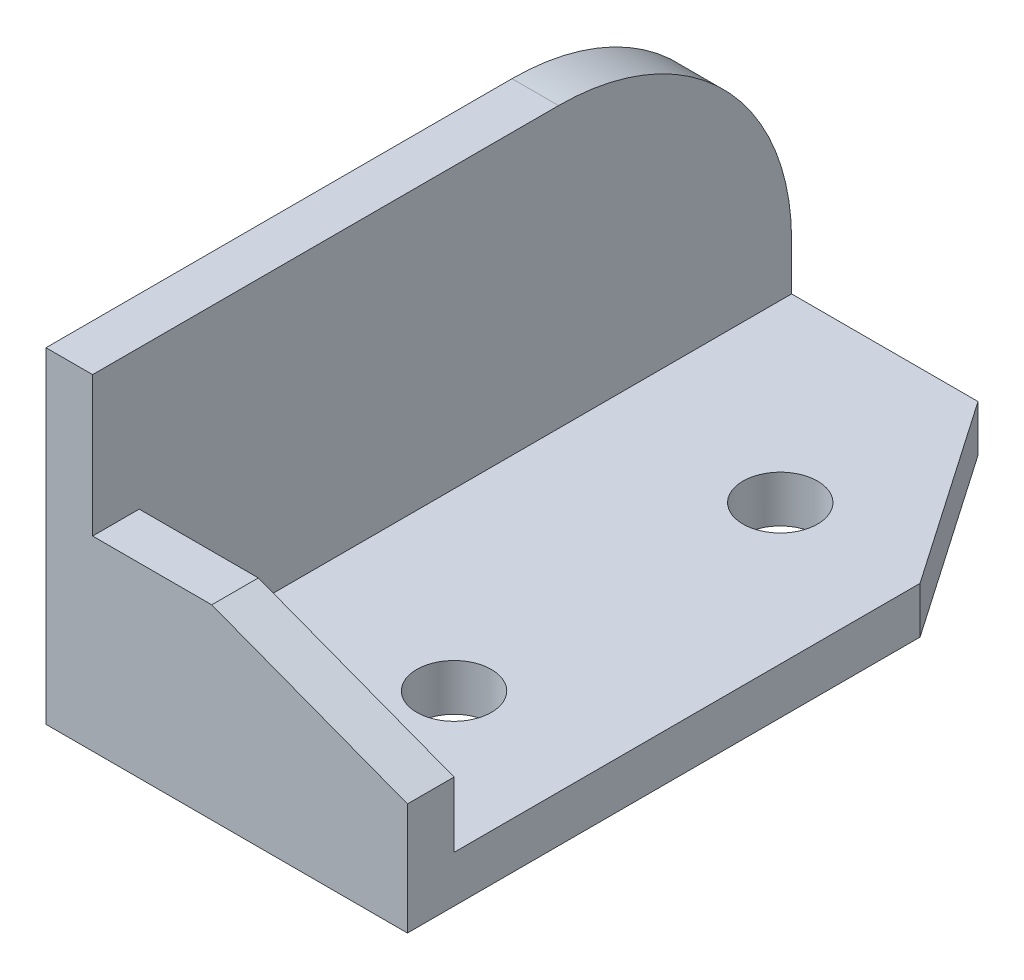
ISO-10303-21;
HEADER;
FILE_DESCRIPTION(('STEP AP214'),'2;1');
FILE_NAME('part.step','',(''),(''),'','','');
FILE_SCHEMA(('AUTOMOTIVE_DESIGN { 1 0 10303 214 1 1 1 1 }'));
ENDSEC;
DATA;
#1=APPLICATION_CONTEXT('core data for automotive mechanical design processes');
#2=APPLICATION_PROTOCOL_DEFINITION('international standard','automotive_design',2000,#1);
#3=PRODUCT_CONTEXT('',#1,'mechanical');
#4=PRODUCT('Part','Part','',(#3));
#5=PRODUCT_RELATED_PRODUCT_CATEGORY('part','',(#4));
#6=PRODUCT_DEFINITION_FORMATION('','',#4);
#7=PRODUCT_DEFINITION_CONTEXT('part definition',#1,'design');
#8=PRODUCT_DEFINITION('design','',#6,#7);
#9=PRODUCT_DEFINITION_SHAPE('','',#8);
#10=(LENGTH_UNIT() NAMED_UNIT(*) SI_UNIT(.MILLI.,.METRE.));
#11=(NAMED_UNIT(*) PLANE_ANGLE_UNIT() SI_UNIT($,.RADIAN.));
#12=(NAMED_UNIT(*) SI_UNIT($,.STERADIAN.) SOLID_ANGLE_UNIT());
#13=UNCERTAINTY_MEASURE_WITH_UNIT(LENGTH_MEASURE(1.E-05),#10,'distance_accuracy_value','');
#14=(GEOMETRIC_REPRESENTATION_CONTEXT(3) GLOBAL_UNCERTAINTY_ASSIGNED_CONTEXT((#13)) GLOBAL_UNIT_ASSIGNED_CONTEXT((#10,
#11,#12)) REPRESENTATION_CONTEXT('',''));
#15=CARTESIAN_POINT('',(0.,0.,0.));
#16=DIRECTION('',(0.,0.,1.));
#17=DIRECTION('',(1.,0.,0.));
#18=AXIS2_PLACEMENT_3D('',#15,#16,#17);
#19=CARTESIAN_POINT('',(5.,5.,-75.));
#20=DIRECTION('',(1.,0.,0.));
#21=DIRECTION('',(0.,1.,0.));
#22=AXIS2_PLACEMENT_3D('',#19,#20,#21);
#23=PLANE('',#22);
#24=DIRECTION('',(0.,0.,1.));
#25=VECTOR('',#24,1.);
#26=CARTESIAN_POINT('',(5.,20.,-75.));
#27=LINE('',#26,#25);
#28=CARTESIAN_POINT('',(5.,20.,-5.));
#29=VERTEX_POINT('',#28);
#30=CARTESIAN_POINT('',(5.,20.,0.));
#31=VERTEX_POINT('',#30);
#32=EDGE_CURVE('E149',#29,#31,#27,.T.);
#33=ORIENTED_EDGE('',*,*,#32,.F.);
#34=DIRECTION('',(0.,-1.,0.));
#35=VECTOR('',#34,1.);
#36=CARTESIAN_POINT('',(5.,5.,-5.));
#37=LINE('',#36,#35);
#38=CARTESIAN_POINT('',(5.,5.,-5.));
#39=VERTEX_POINT('',#38);
#40=EDGE_CURVE('E153',#29,#39,#37,.T.);
#41=ORIENTED_EDGE('',*,*,#40,.T.);
#42=DIRECTION('',(0.,0.,1.));
#43=VECTOR('',#42,1.);
#44=CARTESIAN_POINT('',(5.,5.,-75.));
#45=LINE('',#44,#43);
#46=CARTESIAN_POINT('',(5.,5.,-75.));
#47=VERTEX_POINT('',#46);
#48=EDGE_CURVE('E222',#47,#39,#45,.T.);
#49=ORIENTED_EDGE('',*,*,#48,.F.);
#50=DIRECTION('',(0.,1.,0.));
#51=VECTOR('',#50,1.);
#52=CARTESIAN_POINT('',(5.,5.,-75.));
#53=LINE('',#52,#51);
#54=CARTESIAN_POINT('',(5.,10.,-75.));
#55=VERTEX_POINT('',#54);
#56=EDGE_CURVE('E193',#47,#55,#53,.T.);
#57=ORIENTED_EDGE('',*,*,#56,.T.);
#58=CARTESIAN_POINT('',(5.,10.,-50.));
#59=DIRECTION('',(1.,0.,0.));
#60=DIRECTION('',(0.,1.,0.));
#61=AXIS2_PLACEMENT_3D('',#58,#59,#60);
#62=CIRCLE('',#61,25.);
#63=CARTESIAN_POINT('',(5.,35.,-50.));
#64=VERTEX_POINT('',#63);
#65=EDGE_CURVE('E242',#55,#64,#62,.T.);
#66=ORIENTED_EDGE('',*,*,#65,.T.);
#67=DIRECTION('',(0.,0.,1.));
#68=VECTOR('',#67,1.);
#69=CARTESIAN_POINT('',(5.,35.,-75.));
#70=LINE('',#69,#68);
#71=CARTESIAN_POINT('',(5.,35.,0.));
#72=VERTEX_POINT('',#71);
#73=EDGE_CURVE('E218',#64,#72,#70,.T.);
#74=ORIENTED_EDGE('',*,*,#73,.T.);
#75=DIRECTION('',(0.,1.,0.));
#76=VECTOR('',#75,1.);
#77=CARTESIAN_POINT('',(5.,5.,0.));
#78=LINE('',#77,#76);
#79=EDGE_CURVE('E208',#31,#72,#78,.T.);
#80=ORIENTED_EDGE('',*,*,#79,.F.);
#81=EDGE_LOOP('',(#33,#41,#49,#57,#66,#74,#80));
#82=FACE_BOUND('',#81,.T.);
#83=ADVANCED_FACE('F43',(#82),#23,.T.);
#84=CARTESIAN_POINT('',(38.7831644011419,5.,-75.));
#85=DIRECTION('',(0.,1.,0.));
#86=DIRECTION('',(-1.,0.,0.));
#87=AXIS2_PLACEMENT_3D('',#84,#85,#86);
#88=PLANE('',#87);
#89=CARTESIAN_POINT('',(23.7831644011419,5.,-55.));
#90=DIRECTION('',(0.,1.,0.));
#91=DIRECTION('',(-1.,0.,0.));
#92=AXIS2_PLACEMENT_3D('',#89,#90,#91);
#93=CIRCLE('',#92,4.);
#94=CARTESIAN_POINT('',(19.7831644011419,5.,-55.));
#95=VERTEX_POINT('',#94);
#96=EDGE_CURVE('E164',#95,#95,#93,.T.);
#97=ORIENTED_EDGE('',*,*,#96,.F.);
#98=EDGE_LOOP('',(#97));
#99=FACE_BOUND('',#98,.T.);
#100=CARTESIAN_POINT('',(23.7831644011419,5.,-20.));
#101=DIRECTION('',(0.,1.,0.));
#102=DIRECTION('',(-1.,0.,0.));
#103=AXIS2_PLACEMENT_3D('',#100,#101,#102);
#104=CIRCLE('',#103,4.);
#105=CARTESIAN_POINT('',(19.7831644011419,5.,-20.));
#106=VERTEX_POINT('',#105);
#107=EDGE_CURVE('E163',#106,#106,#104,.T.);
#108=ORIENTED_EDGE('',*,*,#107,.F.);
#109=EDGE_LOOP('',(#108));
#110=FACE_BOUND('',#109,.T.);
#111=ORIENTED_EDGE('',*,*,#48,.T.);
#112=DIRECTION('',(-1.,0.,0.));
#113=VECTOR('',#112,1.);
#114=CARTESIAN_POINT('',(3.78316440114193,5.,-5.));
#115=LINE('',#114,#113);
#116=CARTESIAN_POINT('',(38.7831644011419,5.,-5.));
#117=VERTEX_POINT('',#116);
#118=EDGE_CURVE('E158',#117,#39,#115,.T.);
#119=ORIENTED_EDGE('',*,*,#118,.F.);
#120=DIRECTION('',(0.,0.,1.));
#121=VECTOR('',#120,1.);
#122=CARTESIAN_POINT('',(38.7831644011419,5.,-75.));
#123=LINE('',#122,#121);
#124=CARTESIAN_POINT('',(38.7831644011419,5.,-55.));
#125=VERTEX_POINT('',#124);
#126=EDGE_CURVE('E147',#125,#117,#123,.T.);
#127=ORIENTED_EDGE('',*,*,#126,.F.);
#128=DIRECTION('',(0.567455622276908,0.,0.823403981497738));
#129=VECTOR('',#128,1.);
#130=CARTESIAN_POINT('',(29.4382600270203,5.,-68.5598823349265));
#131=LINE('',#130,#129);
#132=CARTESIAN_POINT('',(25.,4.99999999999999,-75.));
#133=VERTEX_POINT('',#132);
#134=EDGE_CURVE('E178',#133,#125,#131,.T.);
#135=ORIENTED_EDGE('',*,*,#134,.F.);
#136=DIRECTION('',(-1.,0.,0.));
#137=VECTOR('',#136,1.);
#138=CARTESIAN_POINT('',(38.7831644011419,5.,-75.));
#139=LINE('',#138,#137);
#140=EDGE_CURVE('E190',#133,#47,#139,.T.);
#141=ORIENTED_EDGE('',*,*,#140,.T.);
#142=EDGE_LOOP('',(#111,#119,#127,#135,#141));
#143=FACE_BOUND('',#142,.T.);
#144=ADVANCED_FACE('F279',(#99,#110,#143),#88,.T.);
#145=CARTESIAN_POINT('',(0.,35.,-75.));
#146=DIRECTION('',(-1.,0.,0.));
#147=DIRECTION('',(0.,0.,1.));
#148=AXIS2_PLACEMENT_3D('',#145,#146,#147);
#149=PLANE('',#148);
#150=DIRECTION('',(0.,0.,1.));
#151=VECTOR('',#150,1.);
#152=CARTESIAN_POINT('',(0.,35.,-75.));
#153=LINE('',#152,#151);
#154=CARTESIAN_POINT('',(0.,35.,-50.));
#155=VERTEX_POINT('',#154);
#156=CARTESIAN_POINT('',(0.,35.,0.));
#157=VERTEX_POINT('',#156);
#158=EDGE_CURVE('E214',#155,#157,#153,.T.);
#159=ORIENTED_EDGE('',*,*,#158,.F.);
#160=CARTESIAN_POINT('',(0.,10.,-50.));
#161=DIRECTION('',(-1.,0.,0.));
#162=DIRECTION('',(0.,0.,1.));
#163=AXIS2_PLACEMENT_3D('',#160,#161,#162);
#164=CIRCLE('',#163,25.);
#165=CARTESIAN_POINT('',(0.,10.,-75.));
#166=VERTEX_POINT('',#165);
#167=EDGE_CURVE('E236',#155,#166,#164,.T.);
#168=ORIENTED_EDGE('',*,*,#167,.T.);
#169=DIRECTION('',(0.,-1.,0.));
#170=VECTOR('',#169,1.);
#171=CARTESIAN_POINT('',(0.,35.,-75.));
#172=LINE('',#171,#170);
#173=CARTESIAN_POINT('',(0.,0.,-75.));
#174=VERTEX_POINT('',#173);
#175=EDGE_CURVE('E182',#166,#174,#172,.T.);
#176=ORIENTED_EDGE('',*,*,#175,.T.);
#177=DIRECTION('',(0.,0.,1.));
#178=VECTOR('',#177,1.);
#179=CARTESIAN_POINT('',(0.,0.,-75.));
#180=LINE('',#179,#178);
#181=CARTESIAN_POINT('',(0.,0.,0.));
#182=VERTEX_POINT('',#181);
#183=EDGE_CURVE('E197',#174,#182,#180,.T.);
#184=ORIENTED_EDGE('',*,*,#183,.T.);
#185=DIRECTION('',(0.,-1.,0.));
#186=VECTOR('',#185,1.);
#187=CARTESIAN_POINT('',(0.,35.,0.));
#188=LINE('',#187,#186);
#189=EDGE_CURVE('E181',#157,#182,#188,.T.);
#190=ORIENTED_EDGE('',*,*,#189,.F.);
#191=EDGE_LOOP('',(#159,#168,#176,#184,#190));
#192=FACE_BOUND('',#191,.T.);
#193=ADVANCED_FACE('F300',(#192),#149,.T.);
#194=CARTESIAN_POINT('',(5.,35.,-75.));
#195=DIRECTION('',(0.,1.,0.));
#196=DIRECTION('',(0.,0.,1.));
#197=AXIS2_PLACEMENT_3D('',#194,#195,#196);
#198=PLANE('',#197);
#199=ORIENTED_EDGE('',*,*,#73,.F.);
#200=DIRECTION('',(-1.,0.,0.));
#201=VECTOR('',#200,1.);
#202=CARTESIAN_POINT('',(0.,35.,-50.));
#203=LINE('',#202,#201);
#204=EDGE_CURVE('E217',#64,#155,#203,.T.);
#205=ORIENTED_EDGE('',*,*,#204,.T.);
#206=ORIENTED_EDGE('',*,*,#158,.T.);
#207=DIRECTION('',(-1.,0.,0.));
#208=VECTOR('',#207,1.);
#209=CARTESIAN_POINT('',(5.,35.,0.));
#210=LINE('',#209,#208);
#211=EDGE_CURVE('E186',#72,#157,#210,.T.);
#212=ORIENTED_EDGE('',*,*,#211,.F.);
#213=EDGE_LOOP('',(#199,#205,#206,#212));
#214=FACE_BOUND('',#213,.T.);
#215=ADVANCED_FACE('F298',(#214),#198,.T.);
#216=CARTESIAN_POINT('',(38.7831644011419,0.,-75.));
#217=DIRECTION('',(1.,0.,0.));
#218=DIRECTION('',(0.,0.,-1.));
#219=AXIS2_PLACEMENT_3D('',#216,#217,#218);
#220=PLANE('',#219);
#221=DIRECTION('',(0.,0.,-1.));
#222=VECTOR('',#221,1.);
#223=CARTESIAN_POINT('',(38.7831644011419,12.,10.));
#224=LINE('',#223,#222);
#225=CARTESIAN_POINT('',(38.7831644011419,12.,0.));
#226=VERTEX_POINT('',#225);
#227=CARTESIAN_POINT('',(38.7831644011419,12.,-5.));
#228=VERTEX_POINT('',#227);
#229=EDGE_CURVE('E124',#226,#228,#224,.T.);
#230=ORIENTED_EDGE('',*,*,#229,.F.);
#231=DIRECTION('',(0.,1.,0.));
#232=VECTOR('',#231,1.);
#233=CARTESIAN_POINT('',(38.7831644011419,0.,0.));
#234=LINE('',#233,#232);
#235=CARTESIAN_POINT('',(38.7831644011419,0.,0.));
#236=VERTEX_POINT('',#235);
#237=EDGE_CURVE('E205',#236,#226,#234,.T.);
#238=ORIENTED_EDGE('',*,*,#237,.F.);
#239=DIRECTION('',(0.,0.,1.));
#240=VECTOR('',#239,1.);
#241=CARTESIAN_POINT('',(38.7831644011419,0.,-75.));
#242=LINE('',#241,#240);
#243=CARTESIAN_POINT('',(38.7831644011419,0.,-55.));
#244=VERTEX_POINT('',#243);
#245=EDGE_CURVE('E228',#244,#236,#242,.T.);
#246=ORIENTED_EDGE('',*,*,#245,.F.);
#247=DIRECTION('',(0.,-1.,0.));
#248=VECTOR('',#247,1.);
#249=CARTESIAN_POINT('',(38.7831644011419,75.,-55.));
#250=LINE('',#249,#248);
#251=EDGE_CURVE('E174',#125,#244,#250,.T.);
#252=ORIENTED_EDGE('',*,*,#251,.F.);
#253=ORIENTED_EDGE('',*,*,#126,.T.);
#254=DIRECTION('',(0.,-1.,0.));
#255=VECTOR('',#254,1.);
#256=CARTESIAN_POINT('',(38.7831644011419,20.,-5.));
#257=LINE('',#256,#255);
#258=EDGE_CURVE('E137',#228,#117,#257,.T.);
#259=ORIENTED_EDGE('',*,*,#258,.F.);
#260=EDGE_LOOP('',(#230,#238,#246,#252,#253,#259));
#261=FACE_BOUND('',#260,.T.);
#262=ADVANCED_FACE('F144',(#261),#220,.T.);
#263=CARTESIAN_POINT('',(0.,0.,-75.));
#264=DIRECTION('',(0.,-1.,0.));
#265=DIRECTION('',(0.,0.,-1.));
#266=AXIS2_PLACEMENT_3D('',#263,#264,#265);
#267=PLANE('',#266);
#268=CARTESIAN_POINT('',(23.7831644011419,0.,-55.));
#269=DIRECTION('',(0.,-1.,0.));
#270=DIRECTION('',(0.,0.,-1.));
#271=AXIS2_PLACEMENT_3D('',#268,#269,#270);
#272=CIRCLE('',#271,4.);
#273=CARTESIAN_POINT('',(23.7831644011419,0.,-59.));
#274=VERTEX_POINT('',#273);
#275=EDGE_CURVE('E175',#274,#274,#272,.T.);
#276=ORIENTED_EDGE('',*,*,#275,.F.);
#277=EDGE_LOOP('',(#276));
#278=FACE_BOUND('',#277,.T.);
#279=CARTESIAN_POINT('',(23.7831644011419,0.,-20.));
#280=DIRECTION('',(0.,-1.,0.));
#281=DIRECTION('',(0.,0.,-1.));
#282=AXIS2_PLACEMENT_3D('',#279,#280,#281);
#283=CIRCLE('',#282,4.);
#284=CARTESIAN_POINT('',(23.7831644011419,0.,-24.));
#285=VERTEX_POINT('',#284);
#286=EDGE_CURVE('E168',#285,#285,#283,.T.);
#287=ORIENTED_EDGE('',*,*,#286,.F.);
#288=EDGE_LOOP('',(#287));
#289=FACE_BOUND('',#288,.T.);
#290=DIRECTION('',(-0.567455622276908,0.,-0.823403981497738));
#291=VECTOR('',#290,1.);
#292=CARTESIAN_POINT('',(38.7831644011419,0.,-55.));
#293=LINE('',#292,#291);
#294=CARTESIAN_POINT('',(25.,0.,-75.));
#295=VERTEX_POINT('',#294);
#296=EDGE_CURVE('E66',#244,#295,#293,.T.);
#297=ORIENTED_EDGE('',*,*,#296,.F.);
#298=ORIENTED_EDGE('',*,*,#245,.T.);
#299=DIRECTION('',(1.,0.,0.));
#300=VECTOR('',#299,1.);
#301=CARTESIAN_POINT('',(0.,0.,0.));
#302=LINE('',#301,#300);
#303=EDGE_CURVE('E201',#182,#236,#302,.T.);
#304=ORIENTED_EDGE('',*,*,#303,.F.);
#305=ORIENTED_EDGE('',*,*,#183,.F.);
#306=DIRECTION('',(1.,0.,0.));
#307=VECTOR('',#306,1.);
#308=CARTESIAN_POINT('',(0.,0.,-75.));
#309=LINE('',#308,#307);
#310=EDGE_CURVE('E185',#174,#295,#309,.T.);
#311=ORIENTED_EDGE('',*,*,#310,.T.);
#312=EDGE_LOOP('',(#297,#298,#304,#305,#311));
#313=FACE_BOUND('',#312,.T.);
#314=ADVANCED_FACE('F256',(#278,#289,#313),#267,.T.);
#315=CARTESIAN_POINT('',(0.,0.,-75.));
#316=DIRECTION('',(0.,0.,1.));
#317=DIRECTION('',(1.,0.,0.));
#318=AXIS2_PLACEMENT_3D('',#315,#316,#317);
#319=PLANE('',#318);
#320=ORIENTED_EDGE('',*,*,#140,.F.);
#321=DIRECTION('',(0.,-1.,0.));
#322=VECTOR('',#321,1.);
#323=CARTESIAN_POINT('',(25.,0.,-75.));
#324=LINE('',#323,#322);
#325=EDGE_CURVE('E52',#133,#295,#324,.T.);
#326=ORIENTED_EDGE('',*,*,#325,.T.);
#327=ORIENTED_EDGE('',*,*,#310,.F.);
#328=ORIENTED_EDGE('',*,*,#175,.F.);
#329=DIRECTION('',(-1.,0.,0.));
#330=VECTOR('',#329,1.);
#331=CARTESIAN_POINT('',(5.,10.,-75.));
#332=LINE('',#331,#330);
#333=EDGE_CURVE('E239',#166,#55,#332,.F.);
#334=ORIENTED_EDGE('',*,*,#333,.T.);
#335=ORIENTED_EDGE('',*,*,#56,.F.);
#336=EDGE_LOOP('',(#320,#326,#327,#328,#334,#335));
#337=FACE_BOUND('',#336,.T.);
#338=ADVANCED_FACE('F259',(#337),#319,.F.);
#339=CARTESIAN_POINT('',(0.,0.,0.));
#340=DIRECTION('',(0.,0.,1.));
#341=DIRECTION('',(1.,0.,0.));
#342=AXIS2_PLACEMENT_3D('',#339,#340,#341);
#343=PLANE('',#342);
#344=DIRECTION('',(0.934487734928968,-0.355995327591988,0.));
#345=VECTOR('',#344,1.);
#346=CARTESIAN_POINT('',(8.90717331024373,23.3813299393898,0.));
#347=LINE('',#346,#345);
#348=CARTESIAN_POINT('',(17.7831644011419,20.,0.));
#349=VERTEX_POINT('',#348);
#350=EDGE_CURVE('E127',#349,#226,#347,.T.);
#351=ORIENTED_EDGE('',*,*,#350,.F.);
#352=DIRECTION('',(1.,0.,0.));
#353=VECTOR('',#352,1.);
#354=CARTESIAN_POINT('',(3.78316440114193,20.,0.));
#355=LINE('',#354,#353);
#356=EDGE_CURVE('E155',#31,#349,#355,.T.);
#357=ORIENTED_EDGE('',*,*,#356,.F.);
#358=ORIENTED_EDGE('',*,*,#79,.T.);
#359=ORIENTED_EDGE('',*,*,#211,.T.);
#360=ORIENTED_EDGE('',*,*,#189,.T.);
#361=ORIENTED_EDGE('',*,*,#303,.T.);
#362=ORIENTED_EDGE('',*,*,#237,.T.);
#363=EDGE_LOOP('',(#351,#357,#358,#359,#360,#361,#362));
#364=FACE_BOUND('',#363,.T.);
#365=ADVANCED_FACE('F268',(#364),#343,.T.);
#366=CARTESIAN_POINT('',(5.,10.,-50.));
#367=DIRECTION('',(1.,0.,0.));
#368=DIRECTION('',(0.,0.,-1.));
#369=AXIS2_PLACEMENT_3D('',#366,#367,#368);
#370=CYLINDRICAL_SURFACE('',#369,25.);
#371=ORIENTED_EDGE('',*,*,#65,.F.);
#372=ORIENTED_EDGE('',*,*,#333,.F.);
#373=ORIENTED_EDGE('',*,*,#167,.F.);
#374=ORIENTED_EDGE('',*,*,#204,.F.);
#375=EDGE_LOOP('',(#371,#372,#373,#374));
#376=FACE_BOUND('',#375,.T.);
#377=ADVANCED_FACE('F45',(#376),#370,.T.);
#378=CARTESIAN_POINT('',(38.7831644011419,75.,-55.));
#379=DIRECTION('',(-0.823403981497738,0.,0.567455622276908));
#380=DIRECTION('',(0.567455622276908,0.,0.823403981497738));
#381=AXIS2_PLACEMENT_3D('',#378,#379,#380);
#382=PLANE('',#381);
#383=ORIENTED_EDGE('',*,*,#134,.T.);
#384=ORIENTED_EDGE('',*,*,#251,.T.);
#385=ORIENTED_EDGE('',*,*,#296,.T.);
#386=ORIENTED_EDGE('',*,*,#325,.F.);
#387=EDGE_LOOP('',(#383,#384,#385,#386));
#388=FACE_BOUND('',#387,.T.);
#389=ADVANCED_FACE('F277',(#388),#382,.F.);
#390=CARTESIAN_POINT('',(23.7831644011419,-10.,-20.));
#391=DIRECTION('',(0.,1.,0.));
#392=DIRECTION('',(-1.,0.,0.));
#393=AXIS2_PLACEMENT_3D('',#390,#391,#392);
#394=CYLINDRICAL_SURFACE('',#393,4.);
#395=ORIENTED_EDGE('',*,*,#286,.T.);
#396=EDGE_LOOP('',(#395));
#397=FACE_BOUND('',#396,.T.);
#398=ORIENTED_EDGE('',*,*,#107,.T.);
#399=EDGE_LOOP('',(#398));
#400=FACE_BOUND('',#399,.T.);
#401=ADVANCED_FACE('F350',(#397,#400),#394,.F.);
#402=CARTESIAN_POINT('',(23.7831644011419,-10.,-55.));
#403=DIRECTION('',(0.,1.,0.));
#404=DIRECTION('',(-1.,0.,0.));
#405=AXIS2_PLACEMENT_3D('',#402,#403,#404);
#406=CYLINDRICAL_SURFACE('',#405,4.);
#407=ORIENTED_EDGE('',*,*,#275,.T.);
#408=EDGE_LOOP('',(#407));
#409=FACE_BOUND('',#408,.T.);
#410=ORIENTED_EDGE('',*,*,#96,.T.);
#411=EDGE_LOOP('',(#410));
#412=FACE_BOUND('',#411,.T.);
#413=ADVANCED_FACE('F253',(#409,#412),#406,.F.);
#414=CARTESIAN_POINT('',(3.78316440114193,20.,-5.));
#415=DIRECTION('',(0.,0.,1.));
#416=DIRECTION('',(1.,0.,0.));
#417=AXIS2_PLACEMENT_3D('',#414,#415,#416);
#418=PLANE('',#417);
#419=DIRECTION('',(-1.,0.,0.));
#420=VECTOR('',#419,1.);
#421=CARTESIAN_POINT('',(3.78316440114193,20.,-5.));
#422=LINE('',#421,#420);
#423=CARTESIAN_POINT('',(17.7831644011419,20.,-5.));
#424=VERTEX_POINT('',#423);
#425=EDGE_CURVE('E140',#424,#29,#422,.T.);
#426=ORIENTED_EDGE('',*,*,#425,.F.);
#427=DIRECTION('',(-0.934487734928968,0.355995327591988,0.));
#428=VECTOR('',#427,1.);
#429=CARTESIAN_POINT('',(38.7831644011419,12.,-5.));
#430=LINE('',#429,#428);
#431=EDGE_CURVE('E58',#228,#424,#430,.T.);
#432=ORIENTED_EDGE('',*,*,#431,.F.);
#433=ORIENTED_EDGE('',*,*,#258,.T.);
#434=ORIENTED_EDGE('',*,*,#118,.T.);
#435=ORIENTED_EDGE('',*,*,#40,.F.);
#436=EDGE_LOOP('',(#426,#432,#433,#434,#435));
#437=FACE_BOUND('',#436,.T.);
#438=ADVANCED_FACE('F136',(#437),#418,.F.);
#439=CARTESIAN_POINT('',(0.,20.,0.));
#440=DIRECTION('',(0.,1.,0.));
#441=DIRECTION('',(-1.,0.,0.));
#442=AXIS2_PLACEMENT_3D('',#439,#440,#441);
#443=PLANE('',#442);
#444=DIRECTION('',(0.,0.,1.));
#445=VECTOR('',#444,1.);
#446=CARTESIAN_POINT('',(17.7831644011419,20.,0.));
#447=LINE('',#446,#445);
#448=EDGE_CURVE('E11',#424,#349,#447,.T.);
#449=ORIENTED_EDGE('',*,*,#448,.F.);
#450=ORIENTED_EDGE('',*,*,#425,.T.);
#451=ORIENTED_EDGE('',*,*,#32,.T.);
#452=ORIENTED_EDGE('',*,*,#356,.T.);
#453=EDGE_LOOP('',(#449,#450,#451,#452));
#454=FACE_BOUND('',#453,.T.);
#455=ADVANCED_FACE('F289',(#454),#443,.T.);
#456=CARTESIAN_POINT('',(38.7831644011419,12.,10.));
#457=DIRECTION('',(-0.355995327591988,-0.934487734928968,0.));
#458=DIRECTION('',(0.934487734928968,-0.355995327591988,0.));
#459=AXIS2_PLACEMENT_3D('',#456,#457,#458);
#460=PLANE('',#459);
#461=ORIENTED_EDGE('',*,*,#350,.T.);
#462=ORIENTED_EDGE('',*,*,#229,.T.);
#463=ORIENTED_EDGE('',*,*,#431,.T.);
#464=ORIENTED_EDGE('',*,*,#448,.T.);
#465=EDGE_LOOP('',(#461,#462,#463,#464));
#466=FACE_BOUND('',#465,.T.);
#467=ADVANCED_FACE('F125',(#466),#460,.F.);
#468=CLOSED_SHELL('',(#83,#144,#193,#215,#262,#314,#338,#365,#377,#389,#401,#413,#438,#455,#467));
#469=MANIFOLD_SOLID_BREP('B2',#468);
#470=ADVANCED_BREP_SHAPE_REPRESENTATION('',(#18,#469),#14);
#471=SHAPE_DEFINITION_REPRESENTATION(#9,#470);
ENDSEC;
END-ISO-10303-21;
